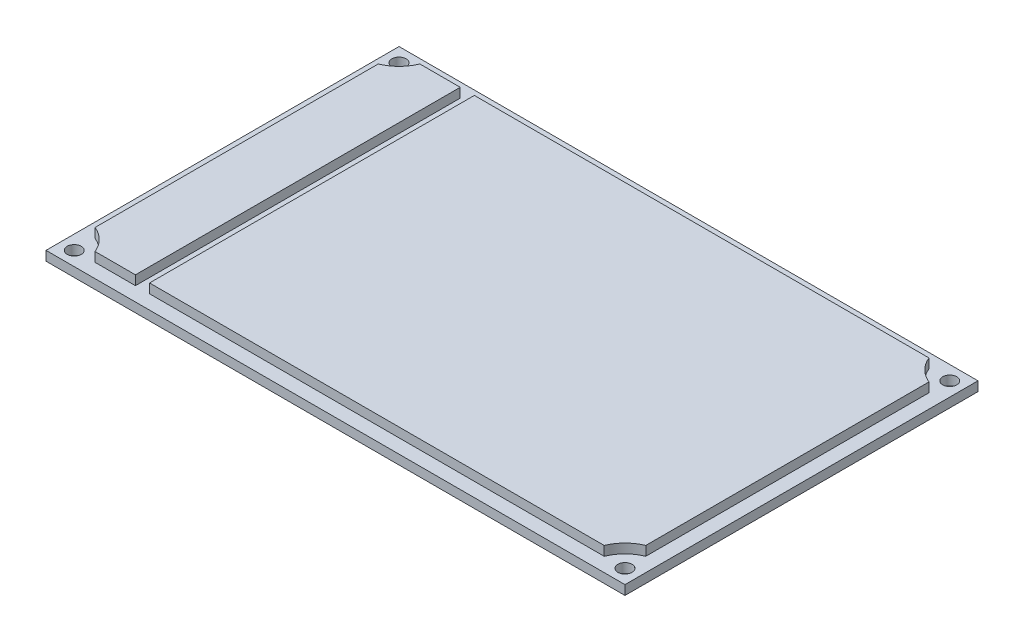
ISO-10303-21;
HEADER;
FILE_DESCRIPTION(('STEP AP214'),'2;1');
FILE_NAME('part.step','',(''),(''),'','','');
FILE_SCHEMA(('AUTOMOTIVE_DESIGN { 1 0 10303 214 1 1 1 1 }'));
ENDSEC;
DATA;
#1=APPLICATION_CONTEXT('core data for automotive mechanical design processes');
#2=APPLICATION_PROTOCOL_DEFINITION('international standard','automotive_design',2000,#1);
#3=PRODUCT_CONTEXT('',#1,'mechanical');
#4=PRODUCT('Part','Part','',(#3));
#5=PRODUCT_RELATED_PRODUCT_CATEGORY('part','',(#4));
#6=PRODUCT_DEFINITION_FORMATION('','',#4);
#7=PRODUCT_DEFINITION_CONTEXT('part definition',#1,'design');
#8=PRODUCT_DEFINITION('design','',#6,#7);
#9=PRODUCT_DEFINITION_SHAPE('','',#8);
#10=(LENGTH_UNIT() NAMED_UNIT(*) SI_UNIT(.MILLI.,.METRE.));
#11=(NAMED_UNIT(*) PLANE_ANGLE_UNIT() SI_UNIT($,.RADIAN.));
#12=(NAMED_UNIT(*) SI_UNIT($,.STERADIAN.) SOLID_ANGLE_UNIT());
#13=UNCERTAINTY_MEASURE_WITH_UNIT(LENGTH_MEASURE(1.E-05),#10,'distance_accuracy_value','');
#14=(GEOMETRIC_REPRESENTATION_CONTEXT(3) GLOBAL_UNCERTAINTY_ASSIGNED_CONTEXT((#13)) GLOBAL_UNIT_ASSIGNED_CONTEXT((#10,
#11,#12)) REPRESENTATION_CONTEXT('',''));
#15=CARTESIAN_POINT('',(0.,0.,0.));
#16=DIRECTION('',(0.,0.,1.));
#17=DIRECTION('',(1.,0.,0.));
#18=AXIS2_PLACEMENT_3D('',#15,#16,#17);
#19=CARTESIAN_POINT('',(0.,0.,0.));
#20=DIRECTION('',(0.,1.,0.));
#21=DIRECTION('',(0.,0.,1.));
#22=AXIS2_PLACEMENT_3D('',#19,#20,#21);
#23=PLANE('',#22);
#24=CARTESIAN_POINT('',(57.2895040173968,0.,-35.0423279715554));
#25=DIRECTION('',(0.,1.,0.));
#26=DIRECTION('',(0.,0.,1.));
#27=AXIS2_PLACEMENT_3D('',#24,#25,#26);
#28=CIRCLE('',#27,1.5);
#29=CARTESIAN_POINT('',(57.2895040173968,0.,-33.5423279715554));
#30=VERTEX_POINT('',#29);
#31=EDGE_CURVE('E284',#30,#30,#28,.T.);
#32=ORIENTED_EDGE('',*,*,#31,.F.);
#33=EDGE_LOOP('',(#32));
#34=FACE_BOUND('',#33,.T.);
#35=CARTESIAN_POINT('',(-59.7104959826032,0.,33.9576720284446));
#36=DIRECTION('',(0.,1.,0.));
#37=DIRECTION('',(0.,0.,1.));
#38=AXIS2_PLACEMENT_3D('',#35,#36,#37);
#39=CIRCLE('',#38,1.5);
#40=CARTESIAN_POINT('',(-59.7104959826032,0.,35.4576720284446));
#41=VERTEX_POINT('',#40);
#42=EDGE_CURVE('E456',#41,#41,#39,.T.);
#43=ORIENTED_EDGE('',*,*,#42,.F.);
#44=EDGE_LOOP('',(#43));
#45=FACE_BOUND('',#44,.T.);
#46=CARTESIAN_POINT('',(-59.7104959826032,0.,-35.0423279715554));
#47=DIRECTION('',(0.,1.,0.));
#48=DIRECTION('',(0.,0.,1.));
#49=AXIS2_PLACEMENT_3D('',#46,#47,#48);
#50=CIRCLE('',#49,1.5);
#51=CARTESIAN_POINT('',(-59.7104959826032,0.,-33.5423279715554));
#52=VERTEX_POINT('',#51);
#53=EDGE_CURVE('E459',#52,#52,#50,.T.);
#54=ORIENTED_EDGE('',*,*,#53,.F.);
#55=EDGE_LOOP('',(#54));
#56=FACE_BOUND('',#55,.T.);
#57=CARTESIAN_POINT('',(57.2895040173968,0.,33.9576720284446));
#58=DIRECTION('',(0.,1.,0.));
#59=DIRECTION('',(0.,0.,1.));
#60=AXIS2_PLACEMENT_3D('',#57,#58,#59);
#61=CIRCLE('',#60,1.5);
#62=CARTESIAN_POINT('',(57.2895040173968,0.,35.4576720284446));
#63=VERTEX_POINT('',#62);
#64=EDGE_CURVE('E175',#63,#63,#61,.T.);
#65=ORIENTED_EDGE('',*,*,#64,.F.);
#66=EDGE_LOOP('',(#65));
#67=FACE_BOUND('',#66,.T.);
#68=DIRECTION('',(-1.,0.,0.));
#69=VECTOR('',#68,1.);
#70=CARTESIAN_POINT('',(-46.7104959826032,0.,-35.0423279715554));
#71=LINE('',#70,#69);
#72=CARTESIAN_POINT('',(-46.7104959826032,0.,-35.0423279715554));
#73=VERTEX_POINT('',#72);
#74=CARTESIAN_POINT('',(-55.2942974955075,0.,-35.0423279715554));
#75=VERTEX_POINT('',#74);
#76=EDGE_CURVE('E229',#73,#75,#71,.T.);
#77=ORIENTED_EDGE('',*,*,#76,.F.);
#78=DIRECTION('',(0.,0.,1.));
#79=VECTOR('',#78,1.);
#80=CARTESIAN_POINT('',(-46.7104959826032,0.,-35.0423279715554));
#81=LINE('',#80,#79);
#82=CARTESIAN_POINT('',(-46.7104959826032,0.,33.9576720284446));
#83=VERTEX_POINT('',#82);
#84=EDGE_CURVE('E239',#73,#83,#81,.T.);
#85=ORIENTED_EDGE('',*,*,#84,.T.);
#86=DIRECTION('',(-1.,0.,0.));
#87=VECTOR('',#86,1.);
#88=CARTESIAN_POINT('',(-46.7104959826032,0.,33.9576720284446));
#89=LINE('',#88,#87);
#90=CARTESIAN_POINT('',(-55.2942974955075,0.,33.9576720284446));
#91=VERTEX_POINT('',#90);
#92=EDGE_CURVE('E265',#83,#91,#89,.T.);
#93=ORIENTED_EDGE('',*,*,#92,.T.);
#94=CARTESIAN_POINT('',(-62.7104959826032,0.,36.9576720284446));
#95=DIRECTION('',(0.,1.,0.));
#96=DIRECTION('',(0.,0.,1.));
#97=AXIS2_PLACEMENT_3D('',#94,#95,#96);
#98=CIRCLE('',#97,7.99999999999999);
#99=CARTESIAN_POINT('',(-59.7104959826032,0.,29.5414735413489));
#100=VERTEX_POINT('',#99);
#101=EDGE_CURVE('E262',#91,#100,#98,.T.);
#102=ORIENTED_EDGE('',*,*,#101,.T.);
#103=DIRECTION('',(0.,0.,1.));
#104=VECTOR('',#103,1.);
#105=CARTESIAN_POINT('',(-59.7104959826032,0.,-30.6261294844598));
#106=LINE('',#105,#104);
#107=CARTESIAN_POINT('',(-59.7104959826032,0.,-30.6261294844598));
#108=VERTEX_POINT('',#107);
#109=EDGE_CURVE('E259',#108,#100,#106,.T.);
#110=ORIENTED_EDGE('',*,*,#109,.F.);
#111=CARTESIAN_POINT('',(-62.7104959826032,0.,-38.0423279715554));
#112=DIRECTION('',(0.,1.,0.));
#113=DIRECTION('',(0.,0.,1.));
#114=AXIS2_PLACEMENT_3D('',#111,#112,#113);
#115=CIRCLE('',#114,8.);
#116=EDGE_CURVE('E256',#108,#75,#115,.T.);
#117=ORIENTED_EDGE('',*,*,#116,.T.);
#118=EDGE_LOOP('',(#77,#85,#93,#102,#110,#117));
#119=FACE_BOUND('',#118,.T.);
#120=DIRECTION('',(0.,0.,1.));
#121=VECTOR('',#120,1.);
#122=CARTESIAN_POINT('',(-62.7104959826032,0.,-38.0423279715554));
#123=LINE('',#122,#121);
#124=CARTESIAN_POINT('',(-62.7104959826032,0.,-38.0423279715554));
#125=VERTEX_POINT('',#124);
#126=CARTESIAN_POINT('',(-62.7104959826032,0.,36.9576720284446));
#127=VERTEX_POINT('',#126);
#128=EDGE_CURVE('E195',#125,#127,#123,.T.);
#129=ORIENTED_EDGE('',*,*,#128,.T.);
#130=DIRECTION('',(1.,0.,0.));
#131=VECTOR('',#130,1.);
#132=CARTESIAN_POINT('',(-62.7104959826032,0.,36.9576720284446));
#133=LINE('',#132,#131);
#134=CARTESIAN_POINT('',(60.2895040173968,0.,36.9576720284446));
#135=VERTEX_POINT('',#134);
#136=EDGE_CURVE('E220',#127,#135,#133,.T.);
#137=ORIENTED_EDGE('',*,*,#136,.T.);
#138=DIRECTION('',(0.,0.,1.));
#139=VECTOR('',#138,1.);
#140=CARTESIAN_POINT('',(60.2895040173968,0.,-38.0423279715554));
#141=LINE('',#140,#139);
#142=CARTESIAN_POINT('',(60.2895040173968,0.,-38.0423279715554));
#143=VERTEX_POINT('',#142);
#144=EDGE_CURVE('E223',#143,#135,#141,.T.);
#145=ORIENTED_EDGE('',*,*,#144,.F.);
#146=DIRECTION('',(1.,0.,0.));
#147=VECTOR('',#146,1.);
#148=CARTESIAN_POINT('',(-62.7104959826032,0.,-38.0423279715554));
#149=LINE('',#148,#147);
#150=EDGE_CURVE('E210',#125,#143,#149,.T.);
#151=ORIENTED_EDGE('',*,*,#150,.F.);
#152=EDGE_LOOP('',(#129,#137,#145,#151));
#153=FACE_BOUND('',#152,.T.);
#154=DIRECTION('',(1.,0.,0.));
#155=VECTOR('',#154,1.);
#156=CARTESIAN_POINT('',(-43.7104959826032,0.,-35.0423279715554));
#157=LINE('',#156,#155);
#158=CARTESIAN_POINT('',(-43.7104959826032,0.,-35.0423279715554));
#159=VERTEX_POINT('',#158);
#160=CARTESIAN_POINT('',(52.8733055303011,0.,-35.0423279715554));
#161=VERTEX_POINT('',#160);
#162=EDGE_CURVE('E185',#159,#161,#157,.T.);
#163=ORIENTED_EDGE('',*,*,#162,.T.);
#164=CARTESIAN_POINT('',(60.2895040173968,0.,-38.0423279715554));
#165=DIRECTION('',(0.,1.,0.));
#166=DIRECTION('',(0.,0.,1.));
#167=AXIS2_PLACEMENT_3D('',#164,#165,#166);
#168=CIRCLE('',#167,7.99999999999999);
#169=CARTESIAN_POINT('',(57.2895040173968,0.,-30.6261294844598));
#170=VERTEX_POINT('',#169);
#171=EDGE_CURVE('E153',#161,#170,#168,.T.);
#172=ORIENTED_EDGE('',*,*,#171,.T.);
#173=DIRECTION('',(0.,0.,1.));
#174=VECTOR('',#173,1.);
#175=CARTESIAN_POINT('',(57.2895040173968,0.,-30.6261294844598));
#176=LINE('',#175,#174);
#177=CARTESIAN_POINT('',(57.2895040173968,0.,29.5414735413489));
#178=VERTEX_POINT('',#177);
#179=EDGE_CURVE('E189',#170,#178,#176,.T.);
#180=ORIENTED_EDGE('',*,*,#179,.T.);
#181=CARTESIAN_POINT('',(60.2895040173968,0.,36.9576720284446));
#182=DIRECTION('',(0.,1.,0.));
#183=DIRECTION('',(0.,0.,1.));
#184=AXIS2_PLACEMENT_3D('',#181,#182,#183);
#185=CIRCLE('',#184,8.);
#186=CARTESIAN_POINT('',(52.8733055303011,0.,33.9576720284446));
#187=VERTEX_POINT('',#186);
#188=EDGE_CURVE('E191',#178,#187,#185,.T.);
#189=ORIENTED_EDGE('',*,*,#188,.T.);
#190=DIRECTION('',(1.,0.,0.));
#191=VECTOR('',#190,1.);
#192=CARTESIAN_POINT('',(-43.7104959826032,0.,33.9576720284446));
#193=LINE('',#192,#191);
#194=CARTESIAN_POINT('',(-43.7104959826032,0.,33.9576720284446));
#195=VERTEX_POINT('',#194);
#196=EDGE_CURVE('E57',#195,#187,#193,.T.);
#197=ORIENTED_EDGE('',*,*,#196,.F.);
#198=DIRECTION('',(0.,0.,1.));
#199=VECTOR('',#198,1.);
#200=CARTESIAN_POINT('',(-43.7104959826032,0.,-35.0423279715554));
#201=LINE('',#200,#199);
#202=EDGE_CURVE('E52',#159,#195,#201,.T.);
#203=ORIENTED_EDGE('',*,*,#202,.F.);
#204=EDGE_LOOP('',(#163,#172,#180,#189,#197,#203));
#205=FACE_BOUND('',#204,.T.);
#206=ADVANCED_FACE('F35',(#34,#45,#56,#67,#119,#153,#205),#23,.T.);
#207=CARTESIAN_POINT('',(-46.7104959826032,2.,-35.0423279715554));
#208=DIRECTION('',(0.,0.,1.));
#209=DIRECTION('',(1.,0.,0.));
#210=AXIS2_PLACEMENT_3D('',#207,#208,#209);
#211=PLANE('',#210);
#212=ORIENTED_EDGE('',*,*,#76,.T.);
#213=DIRECTION('',(0.,-1.,0.));
#214=VECTOR('',#213,1.);
#215=CARTESIAN_POINT('',(-55.2942974955075,2.,-35.0423279715554));
#216=LINE('',#215,#214);
#217=CARTESIAN_POINT('',(-55.2942974955075,2.,-35.0423279715554));
#218=VERTEX_POINT('',#217);
#219=EDGE_CURVE('E11',#218,#75,#216,.T.);
#220=ORIENTED_EDGE('',*,*,#219,.F.);
#221=DIRECTION('',(-1.,0.,0.));
#222=VECTOR('',#221,1.);
#223=CARTESIAN_POINT('',(-46.7104959826032,2.,-35.0423279715554));
#224=LINE('',#223,#222);
#225=CARTESIAN_POINT('',(-46.7104959826032,2.,-35.0423279715554));
#226=VERTEX_POINT('',#225);
#227=EDGE_CURVE('E236',#226,#218,#224,.T.);
#228=ORIENTED_EDGE('',*,*,#227,.F.);
#229=DIRECTION('',(0.,-1.,0.));
#230=VECTOR('',#229,1.);
#231=CARTESIAN_POINT('',(-46.7104959826032,2.,-35.0423279715554));
#232=LINE('',#231,#230);
#233=EDGE_CURVE('E253',#226,#73,#232,.T.);
#234=ORIENTED_EDGE('',*,*,#233,.T.);
#235=EDGE_LOOP('',(#212,#220,#228,#234));
#236=FACE_BOUND('',#235,.T.);
#237=ADVANCED_FACE('F37',(#236),#211,.F.);
#238=CARTESIAN_POINT('',(-62.7104959826032,2.,-38.0423279715554));
#239=DIRECTION('',(0.,-1.,0.));
#240=DIRECTION('',(0.,0.,-1.));
#241=AXIS2_PLACEMENT_3D('',#238,#239,#240);
#242=CYLINDRICAL_SURFACE('',#241,8.);
#243=ORIENTED_EDGE('',*,*,#116,.F.);
#244=DIRECTION('',(0.,-1.,0.));
#245=VECTOR('',#244,1.);
#246=CARTESIAN_POINT('',(-59.7104959826032,2.,-30.6261294844598));
#247=LINE('',#246,#245);
#248=CARTESIAN_POINT('',(-59.7104959826032,2.,-30.6261294844598));
#249=VERTEX_POINT('',#248);
#250=EDGE_CURVE('E44',#249,#108,#247,.T.);
#251=ORIENTED_EDGE('',*,*,#250,.F.);
#252=CARTESIAN_POINT('',(-62.7104959826032,2.,-38.0423279715554));
#253=DIRECTION('',(0.,1.,0.));
#254=DIRECTION('',(0.,0.,1.));
#255=AXIS2_PLACEMENT_3D('',#252,#253,#254);
#256=CIRCLE('',#255,8.);
#257=EDGE_CURVE('E238',#249,#218,#256,.T.);
#258=ORIENTED_EDGE('',*,*,#257,.T.);
#259=ORIENTED_EDGE('',*,*,#219,.T.);
#260=EDGE_LOOP('',(#243,#251,#258,#259));
#261=FACE_BOUND('',#260,.T.);
#262=ADVANCED_FACE('F372',(#261),#242,.F.);
#263=CARTESIAN_POINT('',(-59.7104959826032,2.,-30.6261294844598));
#264=DIRECTION('',(1.,0.,0.));
#265=DIRECTION('',(0.,0.,-1.));
#266=AXIS2_PLACEMENT_3D('',#263,#264,#265);
#267=PLANE('',#266);
#268=ORIENTED_EDGE('',*,*,#109,.T.);
#269=DIRECTION('',(0.,-1.,0.));
#270=VECTOR('',#269,1.);
#271=CARTESIAN_POINT('',(-59.7104959826032,2.,29.5414735413489));
#272=LINE('',#271,#270);
#273=CARTESIAN_POINT('',(-59.7104959826032,2.,29.5414735413489));
#274=VERTEX_POINT('',#273);
#275=EDGE_CURVE('E276',#274,#100,#272,.T.);
#276=ORIENTED_EDGE('',*,*,#275,.F.);
#277=DIRECTION('',(0.,0.,1.));
#278=VECTOR('',#277,1.);
#279=CARTESIAN_POINT('',(-59.7104959826032,2.,-30.6261294844598));
#280=LINE('',#279,#278);
#281=EDGE_CURVE('E242',#249,#274,#280,.T.);
#282=ORIENTED_EDGE('',*,*,#281,.F.);
#283=ORIENTED_EDGE('',*,*,#250,.T.);
#284=EDGE_LOOP('',(#268,#276,#282,#283));
#285=FACE_BOUND('',#284,.T.);
#286=ADVANCED_FACE('F369',(#285),#267,.F.);
#287=CARTESIAN_POINT('',(-62.7104959826032,2.,36.9576720284446));
#288=DIRECTION('',(0.,-1.,0.));
#289=DIRECTION('',(0.,0.,-1.));
#290=AXIS2_PLACEMENT_3D('',#287,#288,#289);
#291=CYLINDRICAL_SURFACE('',#290,7.99999999999999);
#292=ORIENTED_EDGE('',*,*,#101,.F.);
#293=DIRECTION('',(0.,-1.,0.));
#294=VECTOR('',#293,1.);
#295=CARTESIAN_POINT('',(-55.2942974955075,2.,33.9576720284446));
#296=LINE('',#295,#294);
#297=CARTESIAN_POINT('',(-55.2942974955075,2.,33.9576720284446));
#298=VERTEX_POINT('',#297);
#299=EDGE_CURVE('E274',#298,#91,#296,.T.);
#300=ORIENTED_EDGE('',*,*,#299,.F.);
#301=CARTESIAN_POINT('',(-62.7104959826032,2.,36.9576720284446));
#302=DIRECTION('',(0.,1.,0.));
#303=DIRECTION('',(0.,0.,1.));
#304=AXIS2_PLACEMENT_3D('',#301,#302,#303);
#305=CIRCLE('',#304,7.99999999999999);
#306=EDGE_CURVE('E244',#298,#274,#305,.T.);
#307=ORIENTED_EDGE('',*,*,#306,.T.);
#308=ORIENTED_EDGE('',*,*,#275,.T.);
#309=EDGE_LOOP('',(#292,#300,#307,#308));
#310=FACE_BOUND('',#309,.T.);
#311=ADVANCED_FACE('F365',(#310),#291,.F.);
#312=CARTESIAN_POINT('',(-46.7104959826032,2.,33.9576720284446));
#313=DIRECTION('',(0.,0.,1.));
#314=DIRECTION('',(1.,0.,0.));
#315=AXIS2_PLACEMENT_3D('',#312,#313,#314);
#316=PLANE('',#315);
#317=ORIENTED_EDGE('',*,*,#92,.F.);
#318=DIRECTION('',(0.,-1.,0.));
#319=VECTOR('',#318,1.);
#320=CARTESIAN_POINT('',(-46.7104959826032,2.,33.9576720284446));
#321=LINE('',#320,#319);
#322=CARTESIAN_POINT('',(-46.7104959826032,2.,33.9576720284446));
#323=VERTEX_POINT('',#322);
#324=EDGE_CURVE('E271',#323,#83,#321,.T.);
#325=ORIENTED_EDGE('',*,*,#324,.F.);
#326=DIRECTION('',(-1.,0.,0.));
#327=VECTOR('',#326,1.);
#328=CARTESIAN_POINT('',(-46.7104959826032,2.,33.9576720284446));
#329=LINE('',#328,#327);
#330=EDGE_CURVE('E247',#323,#298,#329,.T.);
#331=ORIENTED_EDGE('',*,*,#330,.T.);
#332=ORIENTED_EDGE('',*,*,#299,.T.);
#333=EDGE_LOOP('',(#317,#325,#331,#332));
#334=FACE_BOUND('',#333,.T.);
#335=ADVANCED_FACE('F361',(#334),#316,.T.);
#336=CARTESIAN_POINT('',(-46.7104959826032,2.,-35.0423279715554));
#337=DIRECTION('',(1.,0.,0.));
#338=DIRECTION('',(0.,0.,-1.));
#339=AXIS2_PLACEMENT_3D('',#336,#337,#338);
#340=PLANE('',#339);
#341=ORIENTED_EDGE('',*,*,#84,.F.);
#342=ORIENTED_EDGE('',*,*,#233,.F.);
#343=DIRECTION('',(0.,0.,1.));
#344=VECTOR('',#343,1.);
#345=CARTESIAN_POINT('',(-46.7104959826032,2.,-35.0423279715554));
#346=LINE('',#345,#344);
#347=EDGE_CURVE('E250',#226,#323,#346,.T.);
#348=ORIENTED_EDGE('',*,*,#347,.T.);
#349=ORIENTED_EDGE('',*,*,#324,.T.);
#350=EDGE_LOOP('',(#341,#342,#348,#349));
#351=FACE_BOUND('',#350,.T.);
#352=ADVANCED_FACE('F357',(#351),#340,.T.);
#353=CARTESIAN_POINT('',(-62.7104959826032,2.,-38.0423279715554));
#354=DIRECTION('',(0.,1.,0.));
#355=DIRECTION('',(0.,0.,1.));
#356=AXIS2_PLACEMENT_3D('',#353,#354,#355);
#357=PLANE('',#356);
#358=ORIENTED_EDGE('',*,*,#227,.T.);
#359=ORIENTED_EDGE('',*,*,#257,.F.);
#360=ORIENTED_EDGE('',*,*,#281,.T.);
#361=ORIENTED_EDGE('',*,*,#306,.F.);
#362=ORIENTED_EDGE('',*,*,#330,.F.);
#363=ORIENTED_EDGE('',*,*,#347,.F.);
#364=EDGE_LOOP('',(#358,#359,#360,#361,#362,#363));
#365=FACE_BOUND('',#364,.T.);
#366=ADVANCED_FACE('F353',(#365),#357,.T.);
#367=CARTESIAN_POINT('',(-62.7104959826032,-2.,-38.0423279715554));
#368=DIRECTION('',(-1.,0.,0.));
#369=DIRECTION('',(0.,0.,1.));
#370=AXIS2_PLACEMENT_3D('',#367,#368,#369);
#371=PLANE('',#370);
#372=ORIENTED_EDGE('',*,*,#128,.F.);
#373=DIRECTION('',(0.,1.,0.));
#374=VECTOR('',#373,1.);
#375=CARTESIAN_POINT('',(-62.7104959826032,-2.,-38.0423279715554));
#376=LINE('',#375,#374);
#377=CARTESIAN_POINT('',(-62.7104959826032,-2.,-38.0423279715554));
#378=VERTEX_POINT('',#377);
#379=EDGE_CURVE('E227',#378,#125,#376,.T.);
#380=ORIENTED_EDGE('',*,*,#379,.F.);
#381=DIRECTION('',(0.,0.,1.));
#382=VECTOR('',#381,1.);
#383=CARTESIAN_POINT('',(-62.7104959826032,-2.,-38.0423279715554));
#384=LINE('',#383,#382);
#385=CARTESIAN_POINT('',(-62.7104959826032,-2.,36.9576720284446));
#386=VERTEX_POINT('',#385);
#387=EDGE_CURVE('E206',#378,#386,#384,.T.);
#388=ORIENTED_EDGE('',*,*,#387,.T.);
#389=DIRECTION('',(0.,1.,0.));
#390=VECTOR('',#389,1.);
#391=CARTESIAN_POINT('',(-62.7104959826032,-2.,36.9576720284446));
#392=LINE('',#391,#390);
#393=EDGE_CURVE('E217',#386,#127,#392,.T.);
#394=ORIENTED_EDGE('',*,*,#393,.T.);
#395=EDGE_LOOP('',(#372,#380,#388,#394));
#396=FACE_BOUND('',#395,.T.);
#397=ADVANCED_FACE('F343',(#396),#371,.T.);
#398=CARTESIAN_POINT('',(-62.7104959826032,-2.,-38.0423279715554));
#399=DIRECTION('',(0.,0.,1.));
#400=DIRECTION('',(1.,0.,0.));
#401=AXIS2_PLACEMENT_3D('',#398,#399,#400);
#402=PLANE('',#401);
#403=ORIENTED_EDGE('',*,*,#150,.T.);
#404=DIRECTION('',(0.,1.,0.));
#405=VECTOR('',#404,1.);
#406=CARTESIAN_POINT('',(60.2895040173968,-2.,-38.0423279715554));
#407=LINE('',#406,#405);
#408=CARTESIAN_POINT('',(60.2895040173968,-2.,-38.0423279715554));
#409=VERTEX_POINT('',#408);
#410=EDGE_CURVE('E230',#409,#143,#407,.T.);
#411=ORIENTED_EDGE('',*,*,#410,.F.);
#412=DIRECTION('',(1.,0.,0.));
#413=VECTOR('',#412,1.);
#414=CARTESIAN_POINT('',(-62.7104959826032,-2.,-38.0423279715554));
#415=LINE('',#414,#413);
#416=EDGE_CURVE('E215',#378,#409,#415,.T.);
#417=ORIENTED_EDGE('',*,*,#416,.F.);
#418=ORIENTED_EDGE('',*,*,#379,.T.);
#419=EDGE_LOOP('',(#403,#411,#417,#418));
#420=FACE_BOUND('',#419,.T.);
#421=ADVANCED_FACE('F339',(#420),#402,.F.);
#422=CARTESIAN_POINT('',(60.2895040173968,-2.,-38.0423279715554));
#423=DIRECTION('',(-1.,0.,0.));
#424=DIRECTION('',(0.,0.,1.));
#425=AXIS2_PLACEMENT_3D('',#422,#423,#424);
#426=PLANE('',#425);
#427=ORIENTED_EDGE('',*,*,#144,.T.);
#428=DIRECTION('',(0.,1.,0.));
#429=VECTOR('',#428,1.);
#430=CARTESIAN_POINT('',(60.2895040173968,-2.,36.9576720284446));
#431=LINE('',#430,#429);
#432=CARTESIAN_POINT('',(60.2895040173968,-2.,36.9576720284446));
#433=VERTEX_POINT('',#432);
#434=EDGE_CURVE('E233',#433,#135,#431,.T.);
#435=ORIENTED_EDGE('',*,*,#434,.F.);
#436=DIRECTION('',(0.,0.,1.));
#437=VECTOR('',#436,1.);
#438=CARTESIAN_POINT('',(60.2895040173968,-2.,-38.0423279715554));
#439=LINE('',#438,#437);
#440=EDGE_CURVE('E213',#409,#433,#439,.T.);
#441=ORIENTED_EDGE('',*,*,#440,.F.);
#442=ORIENTED_EDGE('',*,*,#410,.T.);
#443=EDGE_LOOP('',(#427,#435,#441,#442));
#444=FACE_BOUND('',#443,.T.);
#445=ADVANCED_FACE('F342',(#444),#426,.F.);
#446=CARTESIAN_POINT('',(-62.7104959826032,-2.,36.9576720284446));
#447=DIRECTION('',(0.,0.,1.));
#448=DIRECTION('',(1.,0.,0.));
#449=AXIS2_PLACEMENT_3D('',#446,#447,#448);
#450=PLANE('',#449);
#451=ORIENTED_EDGE('',*,*,#136,.F.);
#452=ORIENTED_EDGE('',*,*,#393,.F.);
#453=DIRECTION('',(1.,0.,0.));
#454=VECTOR('',#453,1.);
#455=CARTESIAN_POINT('',(-62.7104959826032,-2.,36.9576720284446));
#456=LINE('',#455,#454);
#457=EDGE_CURVE('E209',#386,#433,#456,.T.);
#458=ORIENTED_EDGE('',*,*,#457,.T.);
#459=ORIENTED_EDGE('',*,*,#434,.T.);
#460=EDGE_LOOP('',(#451,#452,#458,#459));
#461=FACE_BOUND('',#460,.T.);
#462=ADVANCED_FACE('F337',(#461),#450,.T.);
#463=CARTESIAN_POINT('',(0.,-2.,0.));
#464=DIRECTION('',(0.,1.,0.));
#465=DIRECTION('',(0.,0.,1.));
#466=AXIS2_PLACEMENT_3D('',#463,#464,#465);
#467=PLANE('',#466);
#468=CARTESIAN_POINT('',(57.2895040173968,-2.,-35.0423279715554));
#469=DIRECTION('',(0.,1.,0.));
#470=DIRECTION('',(0.,0.,1.));
#471=AXIS2_PLACEMENT_3D('',#468,#469,#470);
#472=CIRCLE('',#471,1.5);
#473=CARTESIAN_POINT('',(57.2895040173968,-2.,-33.5423279715554));
#474=VERTEX_POINT('',#473);
#475=EDGE_CURVE('E39',#474,#474,#472,.T.);
#476=ORIENTED_EDGE('',*,*,#475,.T.);
#477=EDGE_LOOP('',(#476));
#478=FACE_BOUND('',#477,.T.);
#479=CARTESIAN_POINT('',(-59.7104959826032,-2.,33.9576720284446));
#480=DIRECTION('',(0.,1.,0.));
#481=DIRECTION('',(0.,0.,1.));
#482=AXIS2_PLACEMENT_3D('',#479,#480,#481);
#483=CIRCLE('',#482,1.5);
#484=CARTESIAN_POINT('',(-59.7104959826032,-2.,35.4576720284446));
#485=VERTEX_POINT('',#484);
#486=EDGE_CURVE('E283',#485,#485,#483,.T.);
#487=ORIENTED_EDGE('',*,*,#486,.T.);
#488=EDGE_LOOP('',(#487));
#489=FACE_BOUND('',#488,.T.);
#490=CARTESIAN_POINT('',(-59.7104959826032,-2.,-35.0423279715554));
#491=DIRECTION('',(0.,1.,0.));
#492=DIRECTION('',(0.,0.,1.));
#493=AXIS2_PLACEMENT_3D('',#490,#491,#492);
#494=CIRCLE('',#493,1.5);
#495=CARTESIAN_POINT('',(-59.7104959826032,-2.,-33.5423279715554));
#496=VERTEX_POINT('',#495);
#497=EDGE_CURVE('E281',#496,#496,#494,.T.);
#498=ORIENTED_EDGE('',*,*,#497,.T.);
#499=EDGE_LOOP('',(#498));
#500=FACE_BOUND('',#499,.T.);
#501=CARTESIAN_POINT('',(57.2895040173968,-2.,33.9576720284446));
#502=DIRECTION('',(0.,1.,0.));
#503=DIRECTION('',(0.,0.,1.));
#504=AXIS2_PLACEMENT_3D('',#501,#502,#503);
#505=CIRCLE('',#504,1.5);
#506=CARTESIAN_POINT('',(57.2895040173968,-2.,35.4576720284446));
#507=VERTEX_POINT('',#506);
#508=EDGE_CURVE('E187',#507,#507,#505,.T.);
#509=ORIENTED_EDGE('',*,*,#508,.T.);
#510=EDGE_LOOP('',(#509));
#511=FACE_BOUND('',#510,.T.);
#512=ORIENTED_EDGE('',*,*,#387,.F.);
#513=ORIENTED_EDGE('',*,*,#416,.T.);
#514=ORIENTED_EDGE('',*,*,#440,.T.);
#515=ORIENTED_EDGE('',*,*,#457,.F.);
#516=EDGE_LOOP('',(#512,#513,#514,#515));
#517=FACE_BOUND('',#516,.T.);
#518=ADVANCED_FACE('F325',(#478,#489,#500,#511,#517),#467,.F.);
#519=CARTESIAN_POINT('',(-43.7104959826032,2.,-35.0423279715554));
#520=DIRECTION('',(0.,0.,-1.));
#521=DIRECTION('',(-1.,0.,0.));
#522=AXIS2_PLACEMENT_3D('',#519,#520,#521);
#523=PLANE('',#522);
#524=ORIENTED_EDGE('',*,*,#162,.F.);
#525=DIRECTION('',(0.,-1.,0.));
#526=VECTOR('',#525,1.);
#527=CARTESIAN_POINT('',(-43.7104959826032,2.,-35.0423279715554));
#528=LINE('',#527,#526);
#529=CARTESIAN_POINT('',(-43.7104959826032,2.,-35.0423279715554));
#530=VERTEX_POINT('',#529);
#531=EDGE_CURVE('E170',#530,#159,#528,.T.);
#532=ORIENTED_EDGE('',*,*,#531,.F.);
#533=DIRECTION('',(1.,0.,0.));
#534=VECTOR('',#533,1.);
#535=CARTESIAN_POINT('',(-43.7104959826032,2.,-35.0423279715554));
#536=LINE('',#535,#534);
#537=CARTESIAN_POINT('',(52.8733055303011,2.,-35.0423279715554));
#538=VERTEX_POINT('',#537);
#539=EDGE_CURVE('E164',#530,#538,#536,.T.);
#540=ORIENTED_EDGE('',*,*,#539,.T.);
#541=DIRECTION('',(0.,-1.,0.));
#542=VECTOR('',#541,1.);
#543=CARTESIAN_POINT('',(52.8733055303011,2.,-35.0423279715554));
#544=LINE('',#543,#542);
#545=EDGE_CURVE('E148',#538,#161,#544,.T.);
#546=ORIENTED_EDGE('',*,*,#545,.T.);
#547=EDGE_LOOP('',(#524,#532,#540,#546));
#548=FACE_BOUND('',#547,.T.);
#549=ADVANCED_FACE('F169',(#548),#523,.T.);
#550=CARTESIAN_POINT('',(-43.7104959826032,2.,-35.0423279715554));
#551=DIRECTION('',(1.,0.,0.));
#552=DIRECTION('',(0.,0.,-1.));
#553=AXIS2_PLACEMENT_3D('',#550,#551,#552);
#554=PLANE('',#553);
#555=ORIENTED_EDGE('',*,*,#202,.T.);
#556=DIRECTION('',(0.,-1.,0.));
#557=VECTOR('',#556,1.);
#558=CARTESIAN_POINT('',(-43.7104959826032,2.,33.9576720284446));
#559=LINE('',#558,#557);
#560=CARTESIAN_POINT('',(-43.7104959826032,2.,33.9576720284446));
#561=VERTEX_POINT('',#560);
#562=EDGE_CURVE('E196',#561,#195,#559,.T.);
#563=ORIENTED_EDGE('',*,*,#562,.F.);
#564=DIRECTION('',(0.,0.,1.));
#565=VECTOR('',#564,1.);
#566=CARTESIAN_POINT('',(-43.7104959826032,2.,-35.0423279715554));
#567=LINE('',#566,#565);
#568=EDGE_CURVE('E158',#530,#561,#567,.T.);
#569=ORIENTED_EDGE('',*,*,#568,.F.);
#570=ORIENTED_EDGE('',*,*,#531,.T.);
#571=EDGE_LOOP('',(#555,#563,#569,#570));
#572=FACE_BOUND('',#571,.T.);
#573=ADVANCED_FACE('F317',(#572),#554,.F.);
#574=CARTESIAN_POINT('',(-43.7104959826032,2.,33.9576720284446));
#575=DIRECTION('',(0.,0.,-1.));
#576=DIRECTION('',(-1.,0.,0.));
#577=AXIS2_PLACEMENT_3D('',#574,#575,#576);
#578=PLANE('',#577);
#579=ORIENTED_EDGE('',*,*,#196,.T.);
#580=DIRECTION('',(0.,-1.,0.));
#581=VECTOR('',#580,1.);
#582=CARTESIAN_POINT('',(52.8733055303011,2.,33.9576720284446));
#583=LINE('',#582,#581);
#584=CARTESIAN_POINT('',(52.8733055303011,2.,33.9576720284446));
#585=VERTEX_POINT('',#584);
#586=EDGE_CURVE('E199',#585,#187,#583,.T.);
#587=ORIENTED_EDGE('',*,*,#586,.F.);
#588=DIRECTION('',(1.,0.,0.));
#589=VECTOR('',#588,1.);
#590=CARTESIAN_POINT('',(-43.7104959826032,2.,33.9576720284446));
#591=LINE('',#590,#589);
#592=EDGE_CURVE('E182',#561,#585,#591,.T.);
#593=ORIENTED_EDGE('',*,*,#592,.F.);
#594=ORIENTED_EDGE('',*,*,#562,.T.);
#595=EDGE_LOOP('',(#579,#587,#593,#594));
#596=FACE_BOUND('',#595,.T.);
#597=ADVANCED_FACE('F314',(#596),#578,.F.);
#598=CARTESIAN_POINT('',(60.2895040173968,2.,36.9576720284446));
#599=DIRECTION('',(0.,-1.,0.));
#600=DIRECTION('',(0.,0.,-1.));
#601=AXIS2_PLACEMENT_3D('',#598,#599,#600);
#602=CYLINDRICAL_SURFACE('',#601,8.);
#603=ORIENTED_EDGE('',*,*,#188,.F.);
#604=DIRECTION('',(0.,-1.,0.));
#605=VECTOR('',#604,1.);
#606=CARTESIAN_POINT('',(57.2895040173968,2.,29.5414735413489));
#607=LINE('',#606,#605);
#608=CARTESIAN_POINT('',(57.2895040173968,2.,29.5414735413489));
#609=VERTEX_POINT('',#608);
#610=EDGE_CURVE('E202',#609,#178,#607,.T.);
#611=ORIENTED_EDGE('',*,*,#610,.F.);
#612=CARTESIAN_POINT('',(60.2895040173968,2.,36.9576720284446));
#613=DIRECTION('',(0.,1.,0.));
#614=DIRECTION('',(0.,0.,1.));
#615=AXIS2_PLACEMENT_3D('',#612,#613,#614);
#616=CIRCLE('',#615,8.);
#617=EDGE_CURVE('E179',#609,#585,#616,.T.);
#618=ORIENTED_EDGE('',*,*,#617,.T.);
#619=ORIENTED_EDGE('',*,*,#586,.T.);
#620=EDGE_LOOP('',(#603,#611,#618,#619));
#621=FACE_BOUND('',#620,.T.);
#622=ADVANCED_FACE('F310',(#621),#602,.F.);
#623=CARTESIAN_POINT('',(57.2895040173968,2.,-30.6261294844598));
#624=DIRECTION('',(1.,0.,0.));
#625=DIRECTION('',(0.,0.,-1.));
#626=AXIS2_PLACEMENT_3D('',#623,#624,#625);
#627=PLANE('',#626);
#628=ORIENTED_EDGE('',*,*,#179,.F.);
#629=DIRECTION('',(0.,-1.,0.));
#630=VECTOR('',#629,1.);
#631=CARTESIAN_POINT('',(57.2895040173968,2.,-30.6261294844598));
#632=LINE('',#631,#630);
#633=CARTESIAN_POINT('',(57.2895040173968,2.,-30.6261294844598));
#634=VERTEX_POINT('',#633);
#635=EDGE_CURVE('E157',#634,#170,#632,.T.);
#636=ORIENTED_EDGE('',*,*,#635,.F.);
#637=DIRECTION('',(0.,0.,1.));
#638=VECTOR('',#637,1.);
#639=CARTESIAN_POINT('',(57.2895040173968,2.,-30.6261294844598));
#640=LINE('',#639,#638);
#641=EDGE_CURVE('E167',#634,#609,#640,.T.);
#642=ORIENTED_EDGE('',*,*,#641,.T.);
#643=ORIENTED_EDGE('',*,*,#610,.T.);
#644=EDGE_LOOP('',(#628,#636,#642,#643));
#645=FACE_BOUND('',#644,.T.);
#646=ADVANCED_FACE('F307',(#645),#627,.T.);
#647=CARTESIAN_POINT('',(60.2895040173968,2.,-38.0423279715554));
#648=DIRECTION('',(0.,-1.,0.));
#649=DIRECTION('',(0.,0.,-1.));
#650=AXIS2_PLACEMENT_3D('',#647,#648,#649);
#651=CYLINDRICAL_SURFACE('',#650,7.99999999999999);
#652=ORIENTED_EDGE('',*,*,#171,.F.);
#653=ORIENTED_EDGE('',*,*,#545,.F.);
#654=CARTESIAN_POINT('',(60.2895040173968,2.,-38.0423279715554));
#655=DIRECTION('',(0.,1.,0.));
#656=DIRECTION('',(0.,0.,1.));
#657=AXIS2_PLACEMENT_3D('',#654,#655,#656);
#658=CIRCLE('',#657,7.99999999999999);
#659=EDGE_CURVE('E152',#538,#634,#658,.T.);
#660=ORIENTED_EDGE('',*,*,#659,.T.);
#661=ORIENTED_EDGE('',*,*,#635,.T.);
#662=EDGE_LOOP('',(#652,#653,#660,#661));
#663=FACE_BOUND('',#662,.T.);
#664=ADVANCED_FACE('F150',(#663),#651,.F.);
#665=CARTESIAN_POINT('',(60.2895040173968,2.,-38.0423279715554));
#666=DIRECTION('',(0.,1.,0.));
#667=DIRECTION('',(0.,0.,1.));
#668=AXIS2_PLACEMENT_3D('',#665,#666,#667);
#669=PLANE('',#668);
#670=ORIENTED_EDGE('',*,*,#539,.F.);
#671=ORIENTED_EDGE('',*,*,#568,.T.);
#672=ORIENTED_EDGE('',*,*,#592,.T.);
#673=ORIENTED_EDGE('',*,*,#617,.F.);
#674=ORIENTED_EDGE('',*,*,#641,.F.);
#675=ORIENTED_EDGE('',*,*,#659,.F.);
#676=EDGE_LOOP('',(#670,#671,#672,#673,#674,#675));
#677=FACE_BOUND('',#676,.T.);
#678=ADVANCED_FACE('F163',(#677),#669,.T.);
#679=CARTESIAN_POINT('',(57.2895040173968,-12.,33.9576720284446));
#680=DIRECTION('',(0.,1.,0.));
#681=DIRECTION('',(0.,0.,1.));
#682=AXIS2_PLACEMENT_3D('',#679,#680,#681);
#683=CYLINDRICAL_SURFACE('',#682,1.5);
#684=ORIENTED_EDGE('',*,*,#64,.T.);
#685=EDGE_LOOP('',(#684));
#686=FACE_BOUND('',#685,.T.);
#687=ORIENTED_EDGE('',*,*,#508,.F.);
#688=EDGE_LOOP('',(#687));
#689=FACE_BOUND('',#688,.T.);
#690=ADVANCED_FACE('F294',(#686,#689),#683,.F.);
#691=CARTESIAN_POINT('',(-59.7104959826032,-12.,-35.0423279715554));
#692=DIRECTION('',(0.,1.,0.));
#693=DIRECTION('',(0.,0.,1.));
#694=AXIS2_PLACEMENT_3D('',#691,#692,#693);
#695=CYLINDRICAL_SURFACE('',#694,1.5);
#696=ORIENTED_EDGE('',*,*,#53,.T.);
#697=EDGE_LOOP('',(#696));
#698=FACE_BOUND('',#697,.T.);
#699=ORIENTED_EDGE('',*,*,#497,.F.);
#700=EDGE_LOOP('',(#699));
#701=FACE_BOUND('',#700,.T.);
#702=ADVANCED_FACE('F421',(#698,#701),#695,.F.);
#703=CARTESIAN_POINT('',(-59.7104959826032,-12.,33.9576720284446));
#704=DIRECTION('',(0.,1.,0.));
#705=DIRECTION('',(0.,0.,1.));
#706=AXIS2_PLACEMENT_3D('',#703,#704,#705);
#707=CYLINDRICAL_SURFACE('',#706,1.5);
#708=ORIENTED_EDGE('',*,*,#42,.T.);
#709=EDGE_LOOP('',(#708));
#710=FACE_BOUND('',#709,.T.);
#711=ORIENTED_EDGE('',*,*,#486,.F.);
#712=EDGE_LOOP('',(#711));
#713=FACE_BOUND('',#712,.T.);
#714=ADVANCED_FACE('F429',(#710,#713),#707,.F.);
#715=CARTESIAN_POINT('',(57.2895040173968,-12.,-35.0423279715554));
#716=DIRECTION('',(0.,1.,0.));
#717=DIRECTION('',(0.,0.,1.));
#718=AXIS2_PLACEMENT_3D('',#715,#716,#717);
#719=CYLINDRICAL_SURFACE('',#718,1.5);
#720=ORIENTED_EDGE('',*,*,#31,.T.);
#721=EDGE_LOOP('',(#720));
#722=FACE_BOUND('',#721,.T.);
#723=ORIENTED_EDGE('',*,*,#475,.F.);
#724=EDGE_LOOP('',(#723));
#725=FACE_BOUND('',#724,.T.);
#726=ADVANCED_FACE('F439',(#722,#725),#719,.F.);
#727=CLOSED_SHELL('',(#206,#237,#262,#286,#311,#335,#352,#366,#397,#421,#445,#462,#518,#549,
#573,#597,#622,#646,#664,#678,#690,#702,#714,#726));
#728=MANIFOLD_SOLID_BREP('B2',#727);
#729=ADVANCED_BREP_SHAPE_REPRESENTATION('',(#18,#728),#14);
#730=SHAPE_DEFINITION_REPRESENTATION(#9,#729);
ENDSEC;
END-ISO-10303-21;
